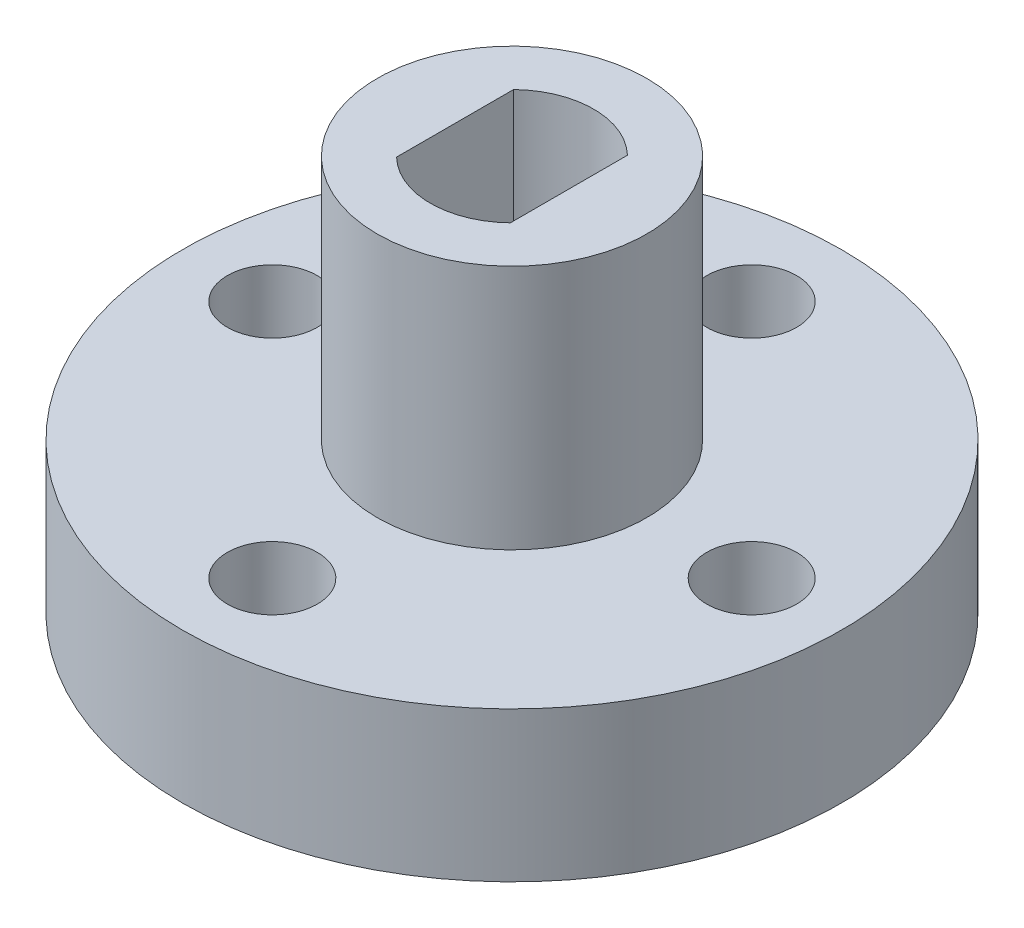
ISO-10303-21;
HEADER;
FILE_DESCRIPTION(('STEP AP214'),'2;1');
FILE_NAME('part.step','',(''),(''),'','','');
FILE_SCHEMA(('AUTOMOTIVE_DESIGN { 1 0 10303 214 1 1 1 1 }'));
ENDSEC;
DATA;
#1=APPLICATION_CONTEXT('core data for automotive mechanical design processes');
#2=APPLICATION_PROTOCOL_DEFINITION('international standard','automotive_design',2000,#1);
#3=PRODUCT_CONTEXT('',#1,'mechanical');
#4=PRODUCT('Part','Part','',(#3));
#5=PRODUCT_RELATED_PRODUCT_CATEGORY('part','',(#4));
#6=PRODUCT_DEFINITION_FORMATION('','',#4);
#7=PRODUCT_DEFINITION_CONTEXT('part definition',#1,'design');
#8=PRODUCT_DEFINITION('design','',#6,#7);
#9=PRODUCT_DEFINITION_SHAPE('','',#8);
#10=(LENGTH_UNIT() NAMED_UNIT(*) SI_UNIT(.MILLI.,.METRE.));
#11=(NAMED_UNIT(*) PLANE_ANGLE_UNIT() SI_UNIT($,.RADIAN.));
#12=(NAMED_UNIT(*) SI_UNIT($,.STERADIAN.) SOLID_ANGLE_UNIT());
#13=UNCERTAINTY_MEASURE_WITH_UNIT(LENGTH_MEASURE(1.E-05),#10,'distance_accuracy_value','');
#14=(GEOMETRIC_REPRESENTATION_CONTEXT(3) GLOBAL_UNCERTAINTY_ASSIGNED_CONTEXT((#13)) GLOBAL_UNIT_ASSIGNED_CONTEXT((#10,
#11,#12)) REPRESENTATION_CONTEXT('',''));
#15=CARTESIAN_POINT('',(0.,0.,0.));
#16=DIRECTION('',(0.,0.,1.));
#17=DIRECTION('',(1.,0.,0.));
#18=AXIS2_PLACEMENT_3D('',#15,#16,#17);
#19=CARTESIAN_POINT('',(0.,8.2,0.));
#20=DIRECTION('',(0.,1.,0.));
#21=DIRECTION('',(0.,0.,1.));
#22=AXIS2_PLACEMENT_3D('',#19,#20,#21);
#23=PLANE('',#22);
#24=CARTESIAN_POINT('',(0.,8.2,0.));
#25=DIRECTION('',(0.,1.,0.));
#26=DIRECTION('',(0.,0.,1.));
#27=AXIS2_PLACEMENT_3D('',#24,#25,#26);
#28=CIRCLE('',#27,4.5);
#29=CARTESIAN_POINT('',(0.,8.2,4.5));
#30=VERTEX_POINT('',#29);
#31=EDGE_CURVE('E119',#30,#30,#28,.T.);
#32=ORIENTED_EDGE('',*,*,#31,.T.);
#33=EDGE_LOOP('',(#32));
#34=FACE_BOUND('',#33,.T.);
#35=DIRECTION('',(0.,0.,1.));
#36=VECTOR('',#35,1.);
#37=CARTESIAN_POINT('',(-1.9,8.2,-1.95336248556176));
#38=LINE('',#37,#36);
#39=CARTESIAN_POINT('',(-1.9,8.2,-1.95336248556176));
#40=VERTEX_POINT('',#39);
#41=CARTESIAN_POINT('',(-1.9,8.2,1.95336248556176));
#42=VERTEX_POINT('',#41);
#43=EDGE_CURVE('E110',#40,#42,#38,.T.);
#44=ORIENTED_EDGE('',*,*,#43,.F.);
#45=CARTESIAN_POINT('',(0.,8.2,0.));
#46=DIRECTION('',(0.,1.,0.));
#47=DIRECTION('',(0.,0.,1.));
#48=AXIS2_PLACEMENT_3D('',#45,#46,#47);
#49=CIRCLE('',#48,2.725);
#50=CARTESIAN_POINT('',(1.9,8.2,-1.95336248556176));
#51=VERTEX_POINT('',#50);
#52=EDGE_CURVE('E88',#51,#40,#49,.T.);
#53=ORIENTED_EDGE('',*,*,#52,.F.);
#54=DIRECTION('',(0.,0.,-1.));
#55=VECTOR('',#54,1.);
#56=CARTESIAN_POINT('',(1.9,8.2,-1.95336248556176));
#57=LINE('',#56,#55);
#58=CARTESIAN_POINT('',(1.9,8.2,1.95336248556176));
#59=VERTEX_POINT('',#58);
#60=EDGE_CURVE('E68',#59,#51,#57,.T.);
#61=ORIENTED_EDGE('',*,*,#60,.F.);
#62=CARTESIAN_POINT('',(0.,8.2,0.));
#63=DIRECTION('',(0.,1.,0.));
#64=DIRECTION('',(0.,0.,1.));
#65=AXIS2_PLACEMENT_3D('',#62,#63,#64);
#66=CIRCLE('',#65,2.725);
#67=EDGE_CURVE('E225',#42,#59,#66,.T.);
#68=ORIENTED_EDGE('',*,*,#67,.F.);
#69=EDGE_LOOP('',(#44,#53,#61,#68));
#70=FACE_BOUND('',#69,.T.);
#71=ADVANCED_FACE('F46',(#34,#70),#23,.T.);
#72=CARTESIAN_POINT('',(0.,8.2,0.));
#73=DIRECTION('',(0.,-1.,0.));
#74=DIRECTION('',(0.,0.,-1.));
#75=AXIS2_PLACEMENT_3D('',#72,#73,#74);
#76=CYLINDRICAL_SURFACE('',#75,4.5);
#77=ORIENTED_EDGE('',*,*,#31,.F.);
#78=EDGE_LOOP('',(#77));
#79=FACE_BOUND('',#78,.T.);
#80=CARTESIAN_POINT('',(0.,0.,0.));
#81=DIRECTION('',(0.,1.,0.));
#82=DIRECTION('',(0.,0.,1.));
#83=AXIS2_PLACEMENT_3D('',#80,#81,#82);
#84=CIRCLE('',#83,4.5);
#85=CARTESIAN_POINT('',(0.,0.,4.5));
#86=VERTEX_POINT('',#85);
#87=EDGE_CURVE('E105',#86,#86,#84,.T.);
#88=ORIENTED_EDGE('',*,*,#87,.T.);
#89=EDGE_LOOP('',(#88));
#90=FACE_BOUND('',#89,.T.);
#91=ADVANCED_FACE('F156',(#79,#90),#76,.T.);
#92=CARTESIAN_POINT('',(0.,8.2,0.));
#93=DIRECTION('',(0.,-1.,0.));
#94=DIRECTION('',(0.,0.,-1.));
#95=AXIS2_PLACEMENT_3D('',#92,#93,#94);
#96=CYLINDRICAL_SURFACE('',#95,2.725);
#97=CARTESIAN_POINT('',(0.,0.,0.));
#98=DIRECTION('',(0.,1.,0.));
#99=DIRECTION('',(0.,0.,1.));
#100=AXIS2_PLACEMENT_3D('',#97,#98,#99);
#101=CIRCLE('',#100,2.725);
#102=CARTESIAN_POINT('',(1.9,0.,-1.95336248556176));
#103=VERTEX_POINT('',#102);
#104=CARTESIAN_POINT('',(-1.9,0.,-1.95336248556176));
#105=VERTEX_POINT('',#104);
#106=EDGE_CURVE('E99',#103,#105,#101,.T.);
#107=ORIENTED_EDGE('',*,*,#106,.F.);
#108=DIRECTION('',(0.,-1.,0.));
#109=VECTOR('',#108,1.);
#110=CARTESIAN_POINT('',(1.9,8.2,-1.95336248556176));
#111=LINE('',#110,#109);
#112=EDGE_CURVE('E91',#51,#103,#111,.T.);
#113=ORIENTED_EDGE('',*,*,#112,.F.);
#114=ORIENTED_EDGE('',*,*,#52,.T.);
#115=DIRECTION('',(0.,-1.,0.));
#116=VECTOR('',#115,1.);
#117=CARTESIAN_POINT('',(-1.9,8.2,-1.95336248556176));
#118=LINE('',#117,#116);
#119=EDGE_CURVE('E101',#40,#105,#118,.T.);
#120=ORIENTED_EDGE('',*,*,#119,.T.);
#121=EDGE_LOOP('',(#107,#113,#114,#120));
#122=FACE_BOUND('',#121,.T.);
#123=ADVANCED_FACE('F100',(#122),#96,.F.);
#124=CARTESIAN_POINT('',(-1.9,8.2,-1.95336248556176));
#125=DIRECTION('',(1.,0.,0.));
#126=DIRECTION('',(0.,0.,-1.));
#127=AXIS2_PLACEMENT_3D('',#124,#125,#126);
#128=PLANE('',#127);
#129=DIRECTION('',(0.,0.,1.));
#130=VECTOR('',#129,1.);
#131=CARTESIAN_POINT('',(-1.9,0.,-1.95336248556176));
#132=LINE('',#131,#130);
#133=CARTESIAN_POINT('',(-1.9,0.,1.95336248556176));
#134=VERTEX_POINT('',#133);
#135=EDGE_CURVE('E104',#105,#134,#132,.T.);
#136=ORIENTED_EDGE('',*,*,#135,.F.);
#137=ORIENTED_EDGE('',*,*,#119,.F.);
#138=ORIENTED_EDGE('',*,*,#43,.T.);
#139=DIRECTION('',(0.,-1.,0.));
#140=VECTOR('',#139,1.);
#141=CARTESIAN_POINT('',(-1.9,8.2,1.95336248556176));
#142=LINE('',#141,#140);
#143=EDGE_CURVE('E116',#42,#134,#142,.T.);
#144=ORIENTED_EDGE('',*,*,#143,.T.);
#145=EDGE_LOOP('',(#136,#137,#138,#144));
#146=FACE_BOUND('',#145,.T.);
#147=ADVANCED_FACE('F167',(#146),#128,.T.);
#148=CARTESIAN_POINT('',(0.,8.2,0.));
#149=DIRECTION('',(0.,-1.,0.));
#150=DIRECTION('',(0.,0.,-1.));
#151=AXIS2_PLACEMENT_3D('',#148,#149,#150);
#152=CYLINDRICAL_SURFACE('',#151,2.725);
#153=CARTESIAN_POINT('',(0.,0.,0.));
#154=DIRECTION('',(0.,1.,0.));
#155=DIRECTION('',(0.,0.,1.));
#156=AXIS2_PLACEMENT_3D('',#153,#154,#155);
#157=CIRCLE('',#156,2.725);
#158=CARTESIAN_POINT('',(1.9,0.,1.95336248556176));
#159=VERTEX_POINT('',#158);
#160=EDGE_CURVE('E108',#134,#159,#157,.T.);
#161=ORIENTED_EDGE('',*,*,#160,.F.);
#162=ORIENTED_EDGE('',*,*,#143,.F.);
#163=ORIENTED_EDGE('',*,*,#67,.T.);
#164=DIRECTION('',(0.,-1.,0.));
#165=VECTOR('',#164,1.);
#166=CARTESIAN_POINT('',(1.9,8.2,1.95336248556176));
#167=LINE('',#166,#165);
#168=EDGE_CURVE('E62',#59,#159,#167,.T.);
#169=ORIENTED_EDGE('',*,*,#168,.T.);
#170=EDGE_LOOP('',(#161,#162,#163,#169));
#171=FACE_BOUND('',#170,.T.);
#172=ADVANCED_FACE('F170',(#171),#152,.F.);
#173=CARTESIAN_POINT('',(1.9,8.2,-1.95336248556176));
#174=DIRECTION('',(-1.,0.,0.));
#175=DIRECTION('',(0.,0.,1.));
#176=AXIS2_PLACEMENT_3D('',#173,#174,#175);
#177=PLANE('',#176);
#178=DIRECTION('',(0.,0.,-1.));
#179=VECTOR('',#178,1.);
#180=CARTESIAN_POINT('',(1.9,0.,-1.95336248556176));
#181=LINE('',#180,#179);
#182=EDGE_CURVE('E95',#159,#103,#181,.T.);
#183=ORIENTED_EDGE('',*,*,#182,.F.);
#184=ORIENTED_EDGE('',*,*,#168,.F.);
#185=ORIENTED_EDGE('',*,*,#60,.T.);
#186=ORIENTED_EDGE('',*,*,#112,.T.);
#187=EDGE_LOOP('',(#183,#184,#185,#186));
#188=FACE_BOUND('',#187,.T.);
#189=ADVANCED_FACE('F93',(#188),#177,.T.);
#190=CARTESIAN_POINT('',(0.,0.,0.));
#191=DIRECTION('',(0.,-1.,0.));
#192=DIRECTION('',(0.,0.,-1.));
#193=AXIS2_PLACEMENT_3D('',#190,#191,#192);
#194=PLANE('',#193);
#195=CARTESIAN_POINT('',(0.,0.,0.));
#196=DIRECTION('',(0.,-1.,0.));
#197=DIRECTION('',(0.,0.,-1.));
#198=AXIS2_PLACEMENT_3D('',#195,#196,#197);
#199=CIRCLE('',#198,1.);
#200=CARTESIAN_POINT('',(0.,0.,-1.));
#201=VERTEX_POINT('',#200);
#202=EDGE_CURVE('E137',#201,#201,#199,.T.);
#203=ORIENTED_EDGE('',*,*,#202,.T.);
#204=EDGE_LOOP('',(#203));
#205=FACE_BOUND('',#204,.T.);
#206=ORIENTED_EDGE('',*,*,#182,.T.);
#207=ORIENTED_EDGE('',*,*,#106,.T.);
#208=ORIENTED_EDGE('',*,*,#135,.T.);
#209=ORIENTED_EDGE('',*,*,#160,.T.);
#210=EDGE_LOOP('',(#206,#207,#208,#209));
#211=FACE_BOUND('',#210,.T.);
#212=ADVANCED_FACE('F107',(#205,#211),#194,.F.);
#213=CARTESIAN_POINT('',(0.,-5.,0.));
#214=DIRECTION('',(0.,1.,0.));
#215=DIRECTION('',(0.,0.,1.));
#216=AXIS2_PLACEMENT_3D('',#213,#214,#215);
#217=CYLINDRICAL_SURFACE('',#216,11.);
#218=CARTESIAN_POINT('',(0.,-5.,0.));
#219=DIRECTION('',(0.,-1.,0.));
#220=DIRECTION('',(0.,0.,-1.));
#221=AXIS2_PLACEMENT_3D('',#218,#219,#220);
#222=CIRCLE('',#221,11.);
#223=CARTESIAN_POINT('',(0.,-5.,-11.));
#224=VERTEX_POINT('',#223);
#225=EDGE_CURVE('E124',#224,#224,#222,.T.);
#226=ORIENTED_EDGE('',*,*,#225,.F.);
#227=EDGE_LOOP('',(#226));
#228=FACE_BOUND('',#227,.T.);
#229=CARTESIAN_POINT('',(0.,0.,0.));
#230=DIRECTION('',(0.,-1.,0.));
#231=DIRECTION('',(0.,0.,-1.));
#232=AXIS2_PLACEMENT_3D('',#229,#230,#231);
#233=CIRCLE('',#232,11.);
#234=CARTESIAN_POINT('',(0.,0.,-11.));
#235=VERTEX_POINT('',#234);
#236=EDGE_CURVE('E216',#235,#235,#233,.T.);
#237=ORIENTED_EDGE('',*,*,#236,.T.);
#238=EDGE_LOOP('',(#237));
#239=FACE_BOUND('',#238,.T.);
#240=ADVANCED_FACE('F176',(#228,#239),#217,.T.);
#241=CARTESIAN_POINT('',(0.,-5.,0.));
#242=DIRECTION('',(0.,-1.,0.));
#243=DIRECTION('',(0.,0.,-1.));
#244=AXIS2_PLACEMENT_3D('',#241,#242,#243);
#245=PLANE('',#244);
#246=CARTESIAN_POINT('',(0.,-5.,0.));
#247=DIRECTION('',(0.,-1.,0.));
#248=DIRECTION('',(0.,0.,-1.));
#249=AXIS2_PLACEMENT_3D('',#246,#247,#248);
#250=CIRCLE('',#249,2.50000000000002);
#251=CARTESIAN_POINT('',(0.,-5.,-2.50000000000002));
#252=VERTEX_POINT('',#251);
#253=EDGE_CURVE('E11',#252,#252,#250,.F.);
#254=ORIENTED_EDGE('',*,*,#253,.T.);
#255=EDGE_LOOP('',(#254));
#256=FACE_BOUND('',#255,.T.);
#257=CARTESIAN_POINT('',(0.,-5.,8.));
#258=DIRECTION('',(0.,-1.,0.));
#259=DIRECTION('',(0.,0.,-1.));
#260=AXIS2_PLACEMENT_3D('',#257,#258,#259);
#261=CIRCLE('',#260,1.5);
#262=CARTESIAN_POINT('',(0.,-5.,6.5));
#263=VERTEX_POINT('',#262);
#264=EDGE_CURVE('E129',#263,#263,#261,.T.);
#265=ORIENTED_EDGE('',*,*,#264,.F.);
#266=EDGE_LOOP('',(#265));
#267=FACE_BOUND('',#266,.T.);
#268=CARTESIAN_POINT('',(-8.,-5.,0.));
#269=DIRECTION('',(0.,-1.,0.));
#270=DIRECTION('',(0.,0.,-1.));
#271=AXIS2_PLACEMENT_3D('',#268,#269,#270);
#272=CIRCLE('',#271,1.5);
#273=CARTESIAN_POINT('',(-8.,-5.,-1.5));
#274=VERTEX_POINT('',#273);
#275=EDGE_CURVE('E204',#274,#274,#272,.T.);
#276=ORIENTED_EDGE('',*,*,#275,.F.);
#277=EDGE_LOOP('',(#276));
#278=FACE_BOUND('',#277,.T.);
#279=CARTESIAN_POINT('',(0.,-5.,-8.));
#280=DIRECTION('',(0.,-1.,0.));
#281=DIRECTION('',(0.,0.,-1.));
#282=AXIS2_PLACEMENT_3D('',#279,#280,#281);
#283=CIRCLE('',#282,1.5);
#284=CARTESIAN_POINT('',(0.,-5.,-9.5));
#285=VERTEX_POINT('',#284);
#286=EDGE_CURVE('E234',#285,#285,#283,.T.);
#287=ORIENTED_EDGE('',*,*,#286,.F.);
#288=EDGE_LOOP('',(#287));
#289=FACE_BOUND('',#288,.T.);
#290=CARTESIAN_POINT('',(8.,-5.,0.));
#291=DIRECTION('',(0.,-1.,0.));
#292=DIRECTION('',(0.,0.,-1.));
#293=AXIS2_PLACEMENT_3D('',#290,#291,#292);
#294=CIRCLE('',#293,1.5);
#295=CARTESIAN_POINT('',(8.,-5.,-1.5));
#296=VERTEX_POINT('',#295);
#297=EDGE_CURVE('E231',#296,#296,#294,.T.);
#298=ORIENTED_EDGE('',*,*,#297,.F.);
#299=EDGE_LOOP('',(#298));
#300=FACE_BOUND('',#299,.T.);
#301=ORIENTED_EDGE('',*,*,#225,.T.);
#302=EDGE_LOOP('',(#301));
#303=FACE_BOUND('',#302,.T.);
#304=ADVANCED_FACE('F179',(#256,#267,#278,#289,#300,#303),#245,.T.);
#305=CARTESIAN_POINT('',(0.,0.,8.));
#306=DIRECTION('',(0.,-1.,0.));
#307=DIRECTION('',(0.,0.,-1.));
#308=AXIS2_PLACEMENT_3D('',#305,#306,#307);
#309=CIRCLE('',#308,1.5);
#310=CARTESIAN_POINT('',(0.,0.,6.5));
#311=VERTEX_POINT('',#310);
#312=EDGE_CURVE('E135',#311,#311,#309,.T.);
#313=ORIENTED_EDGE('',*,*,#312,.T.);
#314=EDGE_LOOP('',(#313));
#315=FACE_BOUND('',#314,.T.);
#316=CARTESIAN_POINT('',(-8.,0.,0.));
#317=DIRECTION('',(0.,-1.,0.));
#318=DIRECTION('',(0.,0.,-1.));
#319=AXIS2_PLACEMENT_3D('',#316,#317,#318);
#320=CIRCLE('',#319,1.5);
#321=CARTESIAN_POINT('',(-8.,0.,-1.5));
#322=VERTEX_POINT('',#321);
#323=EDGE_CURVE('E132',#322,#322,#320,.T.);
#324=ORIENTED_EDGE('',*,*,#323,.T.);
#325=EDGE_LOOP('',(#324));
#326=FACE_BOUND('',#325,.T.);
#327=CARTESIAN_POINT('',(0.,0.,-8.));
#328=DIRECTION('',(0.,-1.,0.));
#329=DIRECTION('',(0.,0.,-1.));
#330=AXIS2_PLACEMENT_3D('',#327,#328,#329);
#331=CIRCLE('',#330,1.5);
#332=CARTESIAN_POINT('',(0.,0.,-9.5));
#333=VERTEX_POINT('',#332);
#334=EDGE_CURVE('E128',#333,#333,#331,.T.);
#335=ORIENTED_EDGE('',*,*,#334,.T.);
#336=EDGE_LOOP('',(#335));
#337=FACE_BOUND('',#336,.T.);
#338=CARTESIAN_POINT('',(8.,0.,0.));
#339=DIRECTION('',(0.,-1.,0.));
#340=DIRECTION('',(0.,0.,-1.));
#341=AXIS2_PLACEMENT_3D('',#338,#339,#340);
#342=CIRCLE('',#341,1.5);
#343=CARTESIAN_POINT('',(8.,0.,-1.5));
#344=VERTEX_POINT('',#343);
#345=EDGE_CURVE('E125',#344,#344,#342,.T.);
#346=ORIENTED_EDGE('',*,*,#345,.T.);
#347=EDGE_LOOP('',(#346));
#348=FACE_BOUND('',#347,.T.);
#349=ORIENTED_EDGE('',*,*,#87,.F.);
#350=EDGE_LOOP('',(#349));
#351=FACE_BOUND('',#350,.T.);
#352=ORIENTED_EDGE('',*,*,#236,.F.);
#353=EDGE_LOOP('',(#352));
#354=FACE_BOUND('',#353,.T.);
#355=ADVANCED_FACE('F181',(#315,#326,#337,#348,#351,#354),#194,.F.);
#356=CARTESIAN_POINT('',(0.,8.2,0.));
#357=DIRECTION('',(0.,-1.,0.));
#358=DIRECTION('',(0.,0.,-1.));
#359=AXIS2_PLACEMENT_3D('',#356,#357,#358);
#360=CYLINDRICAL_SURFACE('',#359,1.);
#361=CARTESIAN_POINT('',(0.,-4.13397459621556,0.));
#362=DIRECTION('',(0.,-1.,0.));
#363=DIRECTION('',(0.,0.,-1.));
#364=AXIS2_PLACEMENT_3D('',#361,#362,#363);
#365=CIRCLE('',#364,1.);
#366=CARTESIAN_POINT('',(0.,-4.13397459621556,-1.));
#367=VERTEX_POINT('',#366);
#368=EDGE_CURVE('E55',#367,#367,#365,.T.);
#369=ORIENTED_EDGE('',*,*,#368,.T.);
#370=EDGE_LOOP('',(#369));
#371=FACE_BOUND('',#370,.T.);
#372=ORIENTED_EDGE('',*,*,#202,.F.);
#373=EDGE_LOOP('',(#372));
#374=FACE_BOUND('',#373,.T.);
#375=ADVANCED_FACE('F141',(#371,#374),#360,.F.);
#376=CARTESIAN_POINT('',(8.,8.2,0.));
#377=DIRECTION('',(0.,-1.,0.));
#378=DIRECTION('',(0.,0.,-1.));
#379=AXIS2_PLACEMENT_3D('',#376,#377,#378);
#380=CYLINDRICAL_SURFACE('',#379,1.5);
#381=ORIENTED_EDGE('',*,*,#297,.T.);
#382=EDGE_LOOP('',(#381));
#383=FACE_BOUND('',#382,.T.);
#384=ORIENTED_EDGE('',*,*,#345,.F.);
#385=EDGE_LOOP('',(#384));
#386=FACE_BOUND('',#385,.T.);
#387=ADVANCED_FACE('F189',(#383,#386),#380,.F.);
#388=CARTESIAN_POINT('',(0.,8.2,-8.));
#389=DIRECTION('',(0.,-1.,0.));
#390=DIRECTION('',(0.,0.,-1.));
#391=AXIS2_PLACEMENT_3D('',#388,#389,#390);
#392=CYLINDRICAL_SURFACE('',#391,1.5);
#393=ORIENTED_EDGE('',*,*,#286,.T.);
#394=EDGE_LOOP('',(#393));
#395=FACE_BOUND('',#394,.T.);
#396=ORIENTED_EDGE('',*,*,#334,.F.);
#397=EDGE_LOOP('',(#396));
#398=FACE_BOUND('',#397,.T.);
#399=ADVANCED_FACE('F192',(#395,#398),#392,.F.);
#400=CARTESIAN_POINT('',(-8.,8.2,0.));
#401=DIRECTION('',(0.,-1.,0.));
#402=DIRECTION('',(0.,0.,-1.));
#403=AXIS2_PLACEMENT_3D('',#400,#401,#402);
#404=CYLINDRICAL_SURFACE('',#403,1.5);
#405=ORIENTED_EDGE('',*,*,#275,.T.);
#406=EDGE_LOOP('',(#405));
#407=FACE_BOUND('',#406,.T.);
#408=ORIENTED_EDGE('',*,*,#323,.F.);
#409=EDGE_LOOP('',(#408));
#410=FACE_BOUND('',#409,.T.);
#411=ADVANCED_FACE('F151',(#407,#410),#404,.F.);
#412=CARTESIAN_POINT('',(0.,8.2,8.));
#413=DIRECTION('',(0.,-1.,0.));
#414=DIRECTION('',(0.,0.,-1.));
#415=AXIS2_PLACEMENT_3D('',#412,#413,#414);
#416=CYLINDRICAL_SURFACE('',#415,1.5);
#417=ORIENTED_EDGE('',*,*,#264,.T.);
#418=EDGE_LOOP('',(#417));
#419=FACE_BOUND('',#418,.T.);
#420=ORIENTED_EDGE('',*,*,#312,.F.);
#421=EDGE_LOOP('',(#420));
#422=FACE_BOUND('',#421,.T.);
#423=ADVANCED_FACE('F145',(#419,#422),#416,.F.);
#424=CARTESIAN_POINT('',(0.,-4.13397459621556,0.));
#425=DIRECTION('',(0.,-1.,0.));
#426=DIRECTION('',(0.,0.,-1.));
#427=AXIS2_PLACEMENT_3D('',#424,#425,#426);
#428=CONICAL_SURFACE('',#427,1.,1.0471975511966);
#429=ORIENTED_EDGE('',*,*,#253,.F.);
#430=EDGE_LOOP('',(#429));
#431=FACE_BOUND('',#430,.T.);
#432=ORIENTED_EDGE('',*,*,#368,.F.);
#433=EDGE_LOOP('',(#432));
#434=FACE_BOUND('',#433,.T.);
#435=ADVANCED_FACE('F49',(#431,#434),#428,.F.);
#436=CLOSED_SHELL('',(#71,#91,#123,#147,#172,#189,#212,#240,#304,#355,#375,#387,#399,#411,#423,#435));
#437=MANIFOLD_SOLID_BREP('B2',#436);
#438=ADVANCED_BREP_SHAPE_REPRESENTATION('',(#18,#437),#14);
#439=SHAPE_DEFINITION_REPRESENTATION(#9,#438);
ENDSEC;
END-ISO-10303-21;
